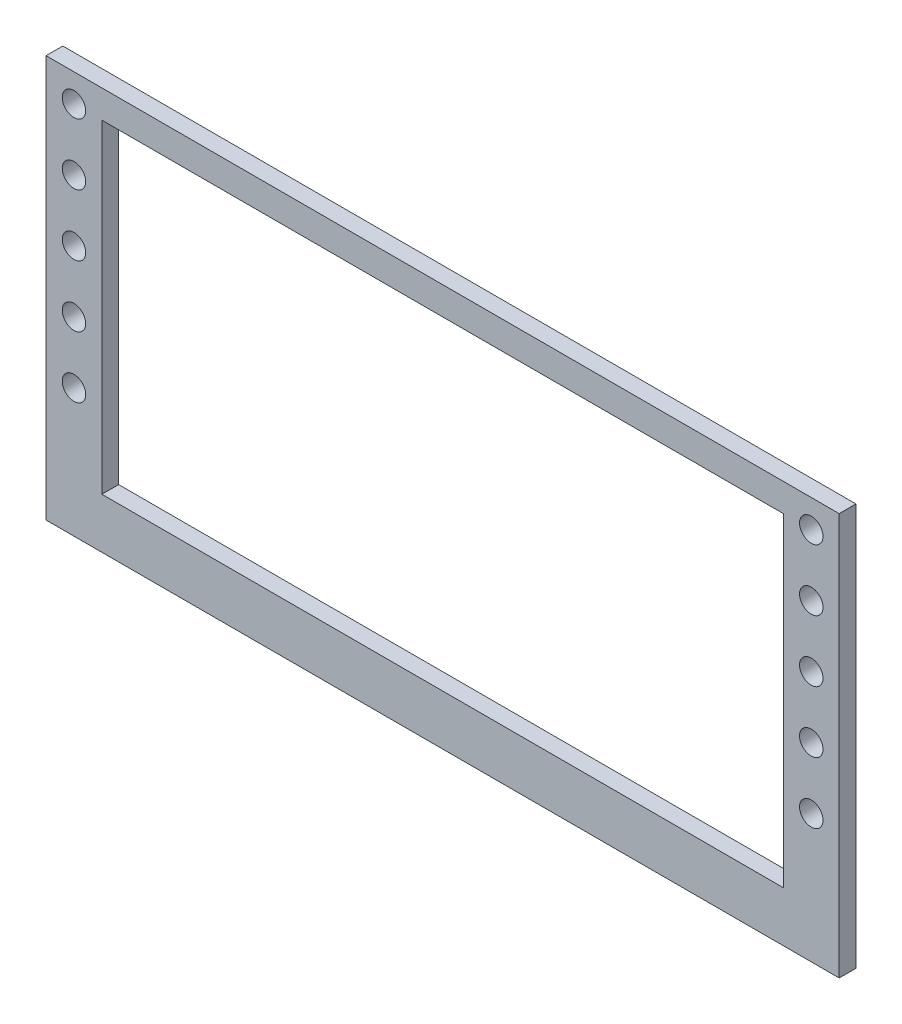
ISO-10303-21;
HEADER;
FILE_DESCRIPTION(('STEP AP214'),'2;1');
FILE_NAME('part.step','',(''),(''),'','','');
FILE_SCHEMA(('AUTOMOTIVE_DESIGN { 1 0 10303 214 1 1 1 1 }'));
ENDSEC;
DATA;
#1=APPLICATION_CONTEXT('core data for automotive mechanical design processes');
#2=APPLICATION_PROTOCOL_DEFINITION('international standard','automotive_design',2000,#1);
#3=PRODUCT_CONTEXT('',#1,'mechanical');
#4=PRODUCT('Part','Part','',(#3));
#5=PRODUCT_RELATED_PRODUCT_CATEGORY('part','',(#4));
#6=PRODUCT_DEFINITION_FORMATION('','',#4);
#7=PRODUCT_DEFINITION_CONTEXT('part definition',#1,'design');
#8=PRODUCT_DEFINITION('design','',#6,#7);
#9=PRODUCT_DEFINITION_SHAPE('','',#8);
#10=(LENGTH_UNIT() NAMED_UNIT(*) SI_UNIT(.MILLI.,.METRE.));
#11=(NAMED_UNIT(*) PLANE_ANGLE_UNIT() SI_UNIT($,.RADIAN.));
#12=(NAMED_UNIT(*) SI_UNIT($,.STERADIAN.) SOLID_ANGLE_UNIT());
#13=UNCERTAINTY_MEASURE_WITH_UNIT(LENGTH_MEASURE(1.E-05),#10,'distance_accuracy_value','');
#14=(GEOMETRIC_REPRESENTATION_CONTEXT(3) GLOBAL_UNCERTAINTY_ASSIGNED_CONTEXT((#13)) GLOBAL_UNIT_ASSIGNED_CONTEXT((#10,
#11,#12)) REPRESENTATION_CONTEXT('',''));
#15=CARTESIAN_POINT('',(0.,0.,0.));
#16=DIRECTION('',(0.,0.,1.));
#17=DIRECTION('',(1.,0.,0.));
#18=AXIS2_PLACEMENT_3D('',#15,#16,#17);
#19=CARTESIAN_POINT('',(0.,0.,3.));
#20=DIRECTION('',(0.,0.,1.));
#21=DIRECTION('',(1.,0.,0.));
#22=AXIS2_PLACEMENT_3D('',#19,#20,#21);
#23=PLANE('',#22);
#24=CARTESIAN_POINT('',(137.,34.,3.));
#25=DIRECTION('',(0.,0.,1.));
#26=DIRECTION('',(1.,0.,0.));
#27=AXIS2_PLACEMENT_3D('',#24,#25,#26);
#28=CIRCLE('',#27,2.10000000000008);
#29=CARTESIAN_POINT('',(139.1,34.,3.));
#30=VERTEX_POINT('',#29);
#31=EDGE_CURVE('E275',#30,#30,#28,.T.);
#32=ORIENTED_EDGE('',*,*,#31,.F.);
#33=EDGE_LOOP('',(#32));
#34=FACE_BOUND('',#33,.T.);
#35=CARTESIAN_POINT('',(137.,56.,3.));
#36=DIRECTION('',(0.,0.,1.));
#37=DIRECTION('',(1.,0.,0.));
#38=AXIS2_PLACEMENT_3D('',#35,#36,#37);
#39=CIRCLE('',#38,2.10000000000008);
#40=CARTESIAN_POINT('',(139.1,56.,3.));
#41=VERTEX_POINT('',#40);
#42=EDGE_CURVE('E287',#41,#41,#39,.T.);
#43=ORIENTED_EDGE('',*,*,#42,.F.);
#44=EDGE_LOOP('',(#43));
#45=FACE_BOUND('',#44,.T.);
#46=CARTESIAN_POINT('',(5.,23.,3.));
#47=DIRECTION('',(0.,0.,1.));
#48=DIRECTION('',(1.,0.,0.));
#49=AXIS2_PLACEMENT_3D('',#46,#47,#48);
#50=CIRCLE('',#49,2.10000000000007);
#51=CARTESIAN_POINT('',(7.10000000000007,23.,3.));
#52=VERTEX_POINT('',#51);
#53=EDGE_CURVE('E299',#52,#52,#50,.T.);
#54=ORIENTED_EDGE('',*,*,#53,.F.);
#55=EDGE_LOOP('',(#54));
#56=FACE_BOUND('',#55,.T.);
#57=CARTESIAN_POINT('',(5.,45.,3.));
#58=DIRECTION('',(0.,0.,1.));
#59=DIRECTION('',(1.,0.,0.));
#60=AXIS2_PLACEMENT_3D('',#57,#58,#59);
#61=CIRCLE('',#60,2.10000000000007);
#62=CARTESIAN_POINT('',(7.10000000000007,45.,3.));
#63=VERTEX_POINT('',#62);
#64=EDGE_CURVE('E311',#63,#63,#61,.T.);
#65=ORIENTED_EDGE('',*,*,#64,.F.);
#66=EDGE_LOOP('',(#65));
#67=FACE_BOUND('',#66,.T.);
#68=CARTESIAN_POINT('',(5.,67.,3.));
#69=DIRECTION('',(0.,0.,1.));
#70=DIRECTION('',(1.,0.,0.));
#71=AXIS2_PLACEMENT_3D('',#68,#69,#70);
#72=CIRCLE('',#71,2.10000000000007);
#73=CARTESIAN_POINT('',(7.10000000000007,67.,3.));
#74=VERTEX_POINT('',#73);
#75=EDGE_CURVE('E133',#74,#74,#72,.T.);
#76=ORIENTED_EDGE('',*,*,#75,.F.);
#77=EDGE_LOOP('',(#76));
#78=FACE_BOUND('',#77,.T.);
#79=DIRECTION('',(0.,-1.,0.));
#80=VECTOR('',#79,1.);
#81=CARTESIAN_POINT('',(0.,72.,3.));
#82=LINE('',#81,#80);
#83=CARTESIAN_POINT('',(0.,72.,3.));
#84=VERTEX_POINT('',#83);
#85=CARTESIAN_POINT('',(0.,0.,3.));
#86=VERTEX_POINT('',#85);
#87=EDGE_CURVE('E143',#84,#86,#82,.T.);
#88=ORIENTED_EDGE('',*,*,#87,.T.);
#89=DIRECTION('',(1.,0.,0.));
#90=VECTOR('',#89,1.);
#91=CARTESIAN_POINT('',(0.,0.,3.));
#92=LINE('',#91,#90);
#93=CARTESIAN_POINT('',(142.,0.,3.));
#94=VERTEX_POINT('',#93);
#95=EDGE_CURVE('E146',#86,#94,#92,.T.);
#96=ORIENTED_EDGE('',*,*,#95,.T.);
#97=DIRECTION('',(0.,1.,0.));
#98=VECTOR('',#97,1.);
#99=CARTESIAN_POINT('',(142.,72.,3.));
#100=LINE('',#99,#98);
#101=CARTESIAN_POINT('',(142.,72.,3.));
#102=VERTEX_POINT('',#101);
#103=EDGE_CURVE('E149',#94,#102,#100,.T.);
#104=ORIENTED_EDGE('',*,*,#103,.T.);
#105=DIRECTION('',(-1.,0.,0.));
#106=VECTOR('',#105,1.);
#107=CARTESIAN_POINT('',(0.,72.,3.));
#108=LINE('',#107,#106);
#109=EDGE_CURVE('E151',#102,#84,#108,.T.);
#110=ORIENTED_EDGE('',*,*,#109,.T.);
#111=EDGE_LOOP('',(#88,#96,#104,#110));
#112=FACE_BOUND('',#111,.T.);
#113=DIRECTION('',(1.,0.,0.));
#114=VECTOR('',#113,1.);
#115=CARTESIAN_POINT('',(10.,8.99999999999999,3.));
#116=LINE('',#115,#114);
#117=CARTESIAN_POINT('',(10.,8.99999999999999,3.));
#118=VERTEX_POINT('',#117);
#119=CARTESIAN_POINT('',(132.,8.99999999999999,3.));
#120=VERTEX_POINT('',#119);
#121=EDGE_CURVE('E112',#118,#120,#116,.T.);
#122=ORIENTED_EDGE('',*,*,#121,.F.);
#123=DIRECTION('',(0.,-1.,0.));
#124=VECTOR('',#123,1.);
#125=CARTESIAN_POINT('',(9.99999999999999,67.,3.));
#126=LINE('',#125,#124);
#127=CARTESIAN_POINT('',(9.99999999999999,67.,3.));
#128=VERTEX_POINT('',#127);
#129=EDGE_CURVE('E104',#128,#118,#126,.T.);
#130=ORIENTED_EDGE('',*,*,#129,.F.);
#131=DIRECTION('',(-1.,0.,0.));
#132=VECTOR('',#131,1.);
#133=CARTESIAN_POINT('',(9.99999999999999,67.,3.));
#134=LINE('',#133,#132);
#135=CARTESIAN_POINT('',(132.,67.,3.));
#136=VERTEX_POINT('',#135);
#137=EDGE_CURVE('E127',#136,#128,#134,.T.);
#138=ORIENTED_EDGE('',*,*,#137,.F.);
#139=DIRECTION('',(0.,1.,0.));
#140=VECTOR('',#139,1.);
#141=CARTESIAN_POINT('',(132.,67.,3.));
#142=LINE('',#141,#140);
#143=EDGE_CURVE('E125',#120,#136,#142,.T.);
#144=ORIENTED_EDGE('',*,*,#143,.F.);
#145=EDGE_LOOP('',(#122,#130,#138,#144));
#146=FACE_BOUND('',#145,.T.);
#147=CARTESIAN_POINT('',(5.,56.,3.));
#148=DIRECTION('',(0.,0.,1.));
#149=DIRECTION('',(1.,0.,0.));
#150=AXIS2_PLACEMENT_3D('',#147,#148,#149);
#151=CIRCLE('',#150,2.10000000000007);
#152=CARTESIAN_POINT('',(7.10000000000007,56.,3.));
#153=VERTEX_POINT('',#152);
#154=EDGE_CURVE('E317',#153,#153,#151,.T.);
#155=ORIENTED_EDGE('',*,*,#154,.F.);
#156=EDGE_LOOP('',(#155));
#157=FACE_BOUND('',#156,.T.);
#158=CARTESIAN_POINT('',(5.,34.,3.));
#159=DIRECTION('',(0.,0.,1.));
#160=DIRECTION('',(1.,0.,0.));
#161=AXIS2_PLACEMENT_3D('',#158,#159,#160);
#162=CIRCLE('',#161,2.10000000000007);
#163=CARTESIAN_POINT('',(7.10000000000007,34.,3.));
#164=VERTEX_POINT('',#163);
#165=EDGE_CURVE('E305',#164,#164,#162,.T.);
#166=ORIENTED_EDGE('',*,*,#165,.F.);
#167=EDGE_LOOP('',(#166));
#168=FACE_BOUND('',#167,.T.);
#169=CARTESIAN_POINT('',(137.,67.,3.));
#170=DIRECTION('',(0.,0.,1.));
#171=DIRECTION('',(1.,0.,0.));
#172=AXIS2_PLACEMENT_3D('',#169,#170,#171);
#173=CIRCLE('',#172,2.10000000000008);
#174=CARTESIAN_POINT('',(139.1,67.,3.));
#175=VERTEX_POINT('',#174);
#176=EDGE_CURVE('E293',#175,#175,#173,.T.);
#177=ORIENTED_EDGE('',*,*,#176,.F.);
#178=EDGE_LOOP('',(#177));
#179=FACE_BOUND('',#178,.T.);
#180=CARTESIAN_POINT('',(137.,45.,3.));
#181=DIRECTION('',(0.,0.,1.));
#182=DIRECTION('',(1.,0.,0.));
#183=AXIS2_PLACEMENT_3D('',#180,#181,#182);
#184=CIRCLE('',#183,2.10000000000008);
#185=CARTESIAN_POINT('',(139.1,45.,3.));
#186=VERTEX_POINT('',#185);
#187=EDGE_CURVE('E281',#186,#186,#184,.T.);
#188=ORIENTED_EDGE('',*,*,#187,.F.);
#189=EDGE_LOOP('',(#188));
#190=FACE_BOUND('',#189,.T.);
#191=CARTESIAN_POINT('',(137.,23.,3.));
#192=DIRECTION('',(0.,0.,1.));
#193=DIRECTION('',(1.,0.,0.));
#194=AXIS2_PLACEMENT_3D('',#191,#192,#193);
#195=CIRCLE('',#194,2.10000000000008);
#196=CARTESIAN_POINT('',(139.1,23.,3.));
#197=VERTEX_POINT('',#196);
#198=EDGE_CURVE('E266',#197,#197,#195,.T.);
#199=ORIENTED_EDGE('',*,*,#198,.F.);
#200=EDGE_LOOP('',(#199));
#201=FACE_BOUND('',#200,.T.);
#202=ADVANCED_FACE('F39',(#34,#45,#56,#67,#78,#112,#146,#157,#168,#179,#190,#201),#23,.T.);
#203=CARTESIAN_POINT('',(0.,0.,0.));
#204=DIRECTION('',(0.,0.,1.));
#205=DIRECTION('',(1.,0.,0.));
#206=AXIS2_PLACEMENT_3D('',#203,#204,#205);
#207=PLANE('',#206);
#208=DIRECTION('',(0.,-1.,0.));
#209=VECTOR('',#208,1.);
#210=CARTESIAN_POINT('',(0.,72.,0.));
#211=LINE('',#210,#209);
#212=CARTESIAN_POINT('',(0.,72.,0.));
#213=VERTEX_POINT('',#212);
#214=CARTESIAN_POINT('',(0.,0.,0.));
#215=VERTEX_POINT('',#214);
#216=EDGE_CURVE('E120',#213,#215,#211,.T.);
#217=ORIENTED_EDGE('',*,*,#216,.F.);
#218=DIRECTION('',(-1.,0.,0.));
#219=VECTOR('',#218,1.);
#220=CARTESIAN_POINT('',(0.,72.,0.));
#221=LINE('',#220,#219);
#222=CARTESIAN_POINT('',(142.,72.,0.));
#223=VERTEX_POINT('',#222);
#224=EDGE_CURVE('E147',#223,#213,#221,.T.);
#225=ORIENTED_EDGE('',*,*,#224,.F.);
#226=DIRECTION('',(0.,1.,0.));
#227=VECTOR('',#226,1.);
#228=CARTESIAN_POINT('',(142.,72.,0.));
#229=LINE('',#228,#227);
#230=CARTESIAN_POINT('',(142.,0.,0.));
#231=VERTEX_POINT('',#230);
#232=EDGE_CURVE('E158',#231,#223,#229,.T.);
#233=ORIENTED_EDGE('',*,*,#232,.F.);
#234=DIRECTION('',(1.,0.,0.));
#235=VECTOR('',#234,1.);
#236=CARTESIAN_POINT('',(0.,0.,0.));
#237=LINE('',#236,#235);
#238=EDGE_CURVE('E156',#215,#231,#237,.T.);
#239=ORIENTED_EDGE('',*,*,#238,.F.);
#240=EDGE_LOOP('',(#217,#225,#233,#239));
#241=FACE_BOUND('',#240,.T.);
#242=DIRECTION('',(0.,-1.,0.));
#243=VECTOR('',#242,1.);
#244=CARTESIAN_POINT('',(9.99999999999999,67.,0.));
#245=LINE('',#244,#243);
#246=CARTESIAN_POINT('',(9.99999999999999,67.,0.));
#247=VERTEX_POINT('',#246);
#248=CARTESIAN_POINT('',(10.,8.99999999999999,0.));
#249=VERTEX_POINT('',#248);
#250=EDGE_CURVE('E62',#247,#249,#245,.T.);
#251=ORIENTED_EDGE('',*,*,#250,.T.);
#252=DIRECTION('',(1.,0.,0.));
#253=VECTOR('',#252,1.);
#254=CARTESIAN_POINT('',(10.,8.99999999999999,0.));
#255=LINE('',#254,#253);
#256=CARTESIAN_POINT('',(132.,8.99999999999999,0.));
#257=VERTEX_POINT('',#256);
#258=EDGE_CURVE('E119',#249,#257,#255,.T.);
#259=ORIENTED_EDGE('',*,*,#258,.T.);
#260=DIRECTION('',(0.,1.,0.));
#261=VECTOR('',#260,1.);
#262=CARTESIAN_POINT('',(132.,67.,0.));
#263=LINE('',#262,#261);
#264=CARTESIAN_POINT('',(132.,67.,0.));
#265=VERTEX_POINT('',#264);
#266=EDGE_CURVE('E135',#257,#265,#263,.T.);
#267=ORIENTED_EDGE('',*,*,#266,.T.);
#268=DIRECTION('',(-1.,0.,0.));
#269=VECTOR('',#268,1.);
#270=CARTESIAN_POINT('',(9.99999999999999,67.,0.));
#271=LINE('',#270,#269);
#272=EDGE_CURVE('E113',#265,#247,#271,.T.);
#273=ORIENTED_EDGE('',*,*,#272,.T.);
#274=EDGE_LOOP('',(#251,#259,#267,#273));
#275=FACE_BOUND('',#274,.T.);
#276=CARTESIAN_POINT('',(5.,67.,0.));
#277=DIRECTION('',(0.,0.,1.));
#278=DIRECTION('',(1.,0.,0.));
#279=AXIS2_PLACEMENT_3D('',#276,#277,#278);
#280=CIRCLE('',#279,2.10000000000007);
#281=CARTESIAN_POINT('',(7.10000000000007,67.,0.));
#282=VERTEX_POINT('',#281);
#283=EDGE_CURVE('E320',#282,#282,#280,.T.);
#284=ORIENTED_EDGE('',*,*,#283,.T.);
#285=EDGE_LOOP('',(#284));
#286=FACE_BOUND('',#285,.T.);
#287=CARTESIAN_POINT('',(5.,56.,0.));
#288=DIRECTION('',(0.,0.,1.));
#289=DIRECTION('',(1.,0.,0.));
#290=AXIS2_PLACEMENT_3D('',#287,#288,#289);
#291=CIRCLE('',#290,2.10000000000007);
#292=CARTESIAN_POINT('',(7.10000000000007,56.,0.));
#293=VERTEX_POINT('',#292);
#294=EDGE_CURVE('E314',#293,#293,#291,.T.);
#295=ORIENTED_EDGE('',*,*,#294,.T.);
#296=EDGE_LOOP('',(#295));
#297=FACE_BOUND('',#296,.T.);
#298=CARTESIAN_POINT('',(5.,45.,0.));
#299=DIRECTION('',(0.,0.,1.));
#300=DIRECTION('',(1.,0.,0.));
#301=AXIS2_PLACEMENT_3D('',#298,#299,#300);
#302=CIRCLE('',#301,2.10000000000007);
#303=CARTESIAN_POINT('',(7.10000000000007,45.,0.));
#304=VERTEX_POINT('',#303);
#305=EDGE_CURVE('E308',#304,#304,#302,.T.);
#306=ORIENTED_EDGE('',*,*,#305,.T.);
#307=EDGE_LOOP('',(#306));
#308=FACE_BOUND('',#307,.T.);
#309=CARTESIAN_POINT('',(5.,34.,0.));
#310=DIRECTION('',(0.,0.,1.));
#311=DIRECTION('',(1.,0.,0.));
#312=AXIS2_PLACEMENT_3D('',#309,#310,#311);
#313=CIRCLE('',#312,2.10000000000007);
#314=CARTESIAN_POINT('',(7.10000000000007,34.,0.));
#315=VERTEX_POINT('',#314);
#316=EDGE_CURVE('E302',#315,#315,#313,.T.);
#317=ORIENTED_EDGE('',*,*,#316,.T.);
#318=EDGE_LOOP('',(#317));
#319=FACE_BOUND('',#318,.T.);
#320=CARTESIAN_POINT('',(5.,23.,0.));
#321=DIRECTION('',(0.,0.,1.));
#322=DIRECTION('',(1.,0.,0.));
#323=AXIS2_PLACEMENT_3D('',#320,#321,#322);
#324=CIRCLE('',#323,2.10000000000007);
#325=CARTESIAN_POINT('',(7.10000000000007,23.,0.));
#326=VERTEX_POINT('',#325);
#327=EDGE_CURVE('E296',#326,#326,#324,.T.);
#328=ORIENTED_EDGE('',*,*,#327,.T.);
#329=EDGE_LOOP('',(#328));
#330=FACE_BOUND('',#329,.T.);
#331=CARTESIAN_POINT('',(137.,67.,0.));
#332=DIRECTION('',(0.,0.,1.));
#333=DIRECTION('',(1.,0.,0.));
#334=AXIS2_PLACEMENT_3D('',#331,#332,#333);
#335=CIRCLE('',#334,2.10000000000008);
#336=CARTESIAN_POINT('',(139.1,67.,0.));
#337=VERTEX_POINT('',#336);
#338=EDGE_CURVE('E290',#337,#337,#335,.T.);
#339=ORIENTED_EDGE('',*,*,#338,.T.);
#340=EDGE_LOOP('',(#339));
#341=FACE_BOUND('',#340,.T.);
#342=CARTESIAN_POINT('',(137.,56.,0.));
#343=DIRECTION('',(0.,0.,1.));
#344=DIRECTION('',(1.,0.,0.));
#345=AXIS2_PLACEMENT_3D('',#342,#343,#344);
#346=CIRCLE('',#345,2.10000000000008);
#347=CARTESIAN_POINT('',(139.1,56.,0.));
#348=VERTEX_POINT('',#347);
#349=EDGE_CURVE('E284',#348,#348,#346,.T.);
#350=ORIENTED_EDGE('',*,*,#349,.T.);
#351=EDGE_LOOP('',(#350));
#352=FACE_BOUND('',#351,.T.);
#353=CARTESIAN_POINT('',(137.,45.,0.));
#354=DIRECTION('',(0.,0.,1.));
#355=DIRECTION('',(1.,0.,0.));
#356=AXIS2_PLACEMENT_3D('',#353,#354,#355);
#357=CIRCLE('',#356,2.10000000000008);
#358=CARTESIAN_POINT('',(139.1,45.,0.));
#359=VERTEX_POINT('',#358);
#360=EDGE_CURVE('E278',#359,#359,#357,.T.);
#361=ORIENTED_EDGE('',*,*,#360,.T.);
#362=EDGE_LOOP('',(#361));
#363=FACE_BOUND('',#362,.T.);
#364=CARTESIAN_POINT('',(137.,34.,0.));
#365=DIRECTION('',(0.,0.,1.));
#366=DIRECTION('',(1.,0.,0.));
#367=AXIS2_PLACEMENT_3D('',#364,#365,#366);
#368=CIRCLE('',#367,2.10000000000008);
#369=CARTESIAN_POINT('',(139.1,34.,0.));
#370=VERTEX_POINT('',#369);
#371=EDGE_CURVE('E272',#370,#370,#368,.T.);
#372=ORIENTED_EDGE('',*,*,#371,.T.);
#373=EDGE_LOOP('',(#372));
#374=FACE_BOUND('',#373,.T.);
#375=CARTESIAN_POINT('',(137.,23.,0.));
#376=DIRECTION('',(0.,0.,1.));
#377=DIRECTION('',(1.,0.,0.));
#378=AXIS2_PLACEMENT_3D('',#375,#376,#377);
#379=CIRCLE('',#378,2.10000000000008);
#380=CARTESIAN_POINT('',(139.1,23.,0.));
#381=VERTEX_POINT('',#380);
#382=EDGE_CURVE('E269',#381,#381,#379,.T.);
#383=ORIENTED_EDGE('',*,*,#382,.T.);
#384=EDGE_LOOP('',(#383));
#385=FACE_BOUND('',#384,.T.);
#386=ADVANCED_FACE('F176',(#241,#275,#286,#297,#308,#319,#330,#341,#352,#363,#374,#385),#207,.F.);
#387=CARTESIAN_POINT('',(0.,72.,3.));
#388=DIRECTION('',(1.,0.,0.));
#389=DIRECTION('',(0.,1.,0.));
#390=AXIS2_PLACEMENT_3D('',#387,#388,#389);
#391=PLANE('',#390);
#392=ORIENTED_EDGE('',*,*,#216,.T.);
#393=DIRECTION('',(0.,0.,-1.));
#394=VECTOR('',#393,1.);
#395=CARTESIAN_POINT('',(0.,0.,3.));
#396=LINE('',#395,#394);
#397=EDGE_CURVE('E11',#86,#215,#396,.T.);
#398=ORIENTED_EDGE('',*,*,#397,.F.);
#399=ORIENTED_EDGE('',*,*,#87,.F.);
#400=DIRECTION('',(0.,0.,-1.));
#401=VECTOR('',#400,1.);
#402=CARTESIAN_POINT('',(0.,72.,3.));
#403=LINE('',#402,#401);
#404=EDGE_CURVE('E153',#84,#213,#403,.T.);
#405=ORIENTED_EDGE('',*,*,#404,.T.);
#406=EDGE_LOOP('',(#392,#398,#399,#405));
#407=FACE_BOUND('',#406,.T.);
#408=ADVANCED_FACE('F41',(#407),#391,.F.);
#409=CARTESIAN_POINT('',(0.,0.,3.));
#410=DIRECTION('',(0.,1.,0.));
#411=DIRECTION('',(0.,0.,1.));
#412=AXIS2_PLACEMENT_3D('',#409,#410,#411);
#413=PLANE('',#412);
#414=ORIENTED_EDGE('',*,*,#238,.T.);
#415=DIRECTION('',(0.,0.,-1.));
#416=VECTOR('',#415,1.);
#417=CARTESIAN_POINT('',(142.,0.,3.));
#418=LINE('',#417,#416);
#419=EDGE_CURVE('E47',#94,#231,#418,.T.);
#420=ORIENTED_EDGE('',*,*,#419,.F.);
#421=ORIENTED_EDGE('',*,*,#95,.F.);
#422=ORIENTED_EDGE('',*,*,#397,.T.);
#423=EDGE_LOOP('',(#414,#420,#421,#422));
#424=FACE_BOUND('',#423,.T.);
#425=ADVANCED_FACE('F186',(#424),#413,.F.);
#426=CARTESIAN_POINT('',(142.,72.,3.));
#427=DIRECTION('',(-1.,0.,0.));
#428=DIRECTION('',(0.,-1.,0.));
#429=AXIS2_PLACEMENT_3D('',#426,#427,#428);
#430=PLANE('',#429);
#431=ORIENTED_EDGE('',*,*,#232,.T.);
#432=DIRECTION('',(0.,0.,-1.));
#433=VECTOR('',#432,1.);
#434=CARTESIAN_POINT('',(142.,72.,3.));
#435=LINE('',#434,#433);
#436=EDGE_CURVE('E163',#102,#223,#435,.T.);
#437=ORIENTED_EDGE('',*,*,#436,.F.);
#438=ORIENTED_EDGE('',*,*,#103,.F.);
#439=ORIENTED_EDGE('',*,*,#419,.T.);
#440=EDGE_LOOP('',(#431,#437,#438,#439));
#441=FACE_BOUND('',#440,.T.);
#442=ADVANCED_FACE('F170',(#441),#430,.F.);
#443=CARTESIAN_POINT('',(0.,72.,3.));
#444=DIRECTION('',(0.,-1.,0.));
#445=DIRECTION('',(0.,0.,-1.));
#446=AXIS2_PLACEMENT_3D('',#443,#444,#445);
#447=PLANE('',#446);
#448=ORIENTED_EDGE('',*,*,#224,.T.);
#449=ORIENTED_EDGE('',*,*,#404,.F.);
#450=ORIENTED_EDGE('',*,*,#109,.F.);
#451=ORIENTED_EDGE('',*,*,#436,.T.);
#452=EDGE_LOOP('',(#448,#449,#450,#451));
#453=FACE_BOUND('',#452,.T.);
#454=ADVANCED_FACE('F180',(#453),#447,.F.);
#455=CARTESIAN_POINT('',(9.99999999999999,67.,3.));
#456=DIRECTION('',(1.,0.,0.));
#457=DIRECTION('',(0.,1.,0.));
#458=AXIS2_PLACEMENT_3D('',#455,#456,#457);
#459=PLANE('',#458);
#460=ORIENTED_EDGE('',*,*,#250,.F.);
#461=DIRECTION('',(0.,0.,-1.));
#462=VECTOR('',#461,1.);
#463=CARTESIAN_POINT('',(9.99999999999999,67.,3.));
#464=LINE('',#463,#462);
#465=EDGE_CURVE('E108',#128,#247,#464,.T.);
#466=ORIENTED_EDGE('',*,*,#465,.F.);
#467=ORIENTED_EDGE('',*,*,#129,.T.);
#468=DIRECTION('',(0.,0.,-1.));
#469=VECTOR('',#468,1.);
#470=CARTESIAN_POINT('',(10.,8.99999999999999,3.));
#471=LINE('',#470,#469);
#472=EDGE_CURVE('E107',#118,#249,#471,.T.);
#473=ORIENTED_EDGE('',*,*,#472,.T.);
#474=EDGE_LOOP('',(#460,#466,#467,#473));
#475=FACE_BOUND('',#474,.T.);
#476=ADVANCED_FACE('F106',(#475),#459,.T.);
#477=CARTESIAN_POINT('',(10.,8.99999999999999,3.));
#478=DIRECTION('',(0.,1.,0.));
#479=DIRECTION('',(0.,0.,1.));
#480=AXIS2_PLACEMENT_3D('',#477,#478,#479);
#481=PLANE('',#480);
#482=ORIENTED_EDGE('',*,*,#258,.F.);
#483=ORIENTED_EDGE('',*,*,#472,.F.);
#484=ORIENTED_EDGE('',*,*,#121,.T.);
#485=DIRECTION('',(0.,0.,-1.));
#486=VECTOR('',#485,1.);
#487=CARTESIAN_POINT('',(132.,8.99999999999999,3.));
#488=LINE('',#487,#486);
#489=EDGE_CURVE('E121',#120,#257,#488,.T.);
#490=ORIENTED_EDGE('',*,*,#489,.T.);
#491=EDGE_LOOP('',(#482,#483,#484,#490));
#492=FACE_BOUND('',#491,.T.);
#493=ADVANCED_FACE('F116',(#492),#481,.T.);
#494=CARTESIAN_POINT('',(132.,67.,3.));
#495=DIRECTION('',(-1.,0.,0.));
#496=DIRECTION('',(0.,-1.,0.));
#497=AXIS2_PLACEMENT_3D('',#494,#495,#496);
#498=PLANE('',#497);
#499=ORIENTED_EDGE('',*,*,#266,.F.);
#500=ORIENTED_EDGE('',*,*,#489,.F.);
#501=ORIENTED_EDGE('',*,*,#143,.T.);
#502=DIRECTION('',(0.,0.,-1.));
#503=VECTOR('',#502,1.);
#504=CARTESIAN_POINT('',(132.,67.,3.));
#505=LINE('',#504,#503);
#506=EDGE_CURVE('E54',#136,#265,#505,.T.);
#507=ORIENTED_EDGE('',*,*,#506,.T.);
#508=EDGE_LOOP('',(#499,#500,#501,#507));
#509=FACE_BOUND('',#508,.T.);
#510=ADVANCED_FACE('F212',(#509),#498,.T.);
#511=CARTESIAN_POINT('',(9.99999999999999,67.,3.));
#512=DIRECTION('',(0.,-1.,0.));
#513=DIRECTION('',(0.,0.,-1.));
#514=AXIS2_PLACEMENT_3D('',#511,#512,#513);
#515=PLANE('',#514);
#516=ORIENTED_EDGE('',*,*,#272,.F.);
#517=ORIENTED_EDGE('',*,*,#506,.F.);
#518=ORIENTED_EDGE('',*,*,#137,.T.);
#519=ORIENTED_EDGE('',*,*,#465,.T.);
#520=EDGE_LOOP('',(#516,#517,#518,#519));
#521=FACE_BOUND('',#520,.T.);
#522=ADVANCED_FACE('F216',(#521),#515,.T.);
#523=CARTESIAN_POINT('',(5.,67.,3.));
#524=DIRECTION('',(0.,0.,-1.));
#525=DIRECTION('',(-1.,0.,0.));
#526=AXIS2_PLACEMENT_3D('',#523,#524,#525);
#527=CYLINDRICAL_SURFACE('',#526,2.10000000000007);
#528=ORIENTED_EDGE('',*,*,#75,.T.);
#529=EDGE_LOOP('',(#528));
#530=FACE_BOUND('',#529,.T.);
#531=ORIENTED_EDGE('',*,*,#283,.F.);
#532=EDGE_LOOP('',(#531));
#533=FACE_BOUND('',#532,.T.);
#534=ADVANCED_FACE('F222',(#530,#533),#527,.F.);
#535=CARTESIAN_POINT('',(5.,56.,3.));
#536=DIRECTION('',(0.,0.,-1.));
#537=DIRECTION('',(-1.,0.,0.));
#538=AXIS2_PLACEMENT_3D('',#535,#536,#537);
#539=CYLINDRICAL_SURFACE('',#538,2.10000000000007);
#540=ORIENTED_EDGE('',*,*,#154,.T.);
#541=EDGE_LOOP('',(#540));
#542=FACE_BOUND('',#541,.T.);
#543=ORIENTED_EDGE('',*,*,#294,.F.);
#544=EDGE_LOOP('',(#543));
#545=FACE_BOUND('',#544,.T.);
#546=ADVANCED_FACE('F225',(#542,#545),#539,.F.);
#547=CARTESIAN_POINT('',(5.,45.,3.));
#548=DIRECTION('',(0.,0.,-1.));
#549=DIRECTION('',(-1.,0.,0.));
#550=AXIS2_PLACEMENT_3D('',#547,#548,#549);
#551=CYLINDRICAL_SURFACE('',#550,2.10000000000007);
#552=ORIENTED_EDGE('',*,*,#64,.T.);
#553=EDGE_LOOP('',(#552));
#554=FACE_BOUND('',#553,.T.);
#555=ORIENTED_EDGE('',*,*,#305,.F.);
#556=EDGE_LOOP('',(#555));
#557=FACE_BOUND('',#556,.T.);
#558=ADVANCED_FACE('F229',(#554,#557),#551,.F.);
#559=CARTESIAN_POINT('',(5.,34.,3.));
#560=DIRECTION('',(0.,0.,-1.));
#561=DIRECTION('',(-1.,0.,0.));
#562=AXIS2_PLACEMENT_3D('',#559,#560,#561);
#563=CYLINDRICAL_SURFACE('',#562,2.10000000000007);
#564=ORIENTED_EDGE('',*,*,#165,.T.);
#565=EDGE_LOOP('',(#564));
#566=FACE_BOUND('',#565,.T.);
#567=ORIENTED_EDGE('',*,*,#316,.F.);
#568=EDGE_LOOP('',(#567));
#569=FACE_BOUND('',#568,.T.);
#570=ADVANCED_FACE('F233',(#566,#569),#563,.F.);
#571=CARTESIAN_POINT('',(5.,23.,3.));
#572=DIRECTION('',(0.,0.,-1.));
#573=DIRECTION('',(-1.,0.,0.));
#574=AXIS2_PLACEMENT_3D('',#571,#572,#573);
#575=CYLINDRICAL_SURFACE('',#574,2.10000000000007);
#576=ORIENTED_EDGE('',*,*,#53,.T.);
#577=EDGE_LOOP('',(#576));
#578=FACE_BOUND('',#577,.T.);
#579=ORIENTED_EDGE('',*,*,#327,.F.);
#580=EDGE_LOOP('',(#579));
#581=FACE_BOUND('',#580,.T.);
#582=ADVANCED_FACE('F237',(#578,#581),#575,.F.);
#583=CARTESIAN_POINT('',(137.,67.,3.));
#584=DIRECTION('',(0.,0.,-1.));
#585=DIRECTION('',(-1.,0.,0.));
#586=AXIS2_PLACEMENT_3D('',#583,#584,#585);
#587=CYLINDRICAL_SURFACE('',#586,2.10000000000008);
#588=ORIENTED_EDGE('',*,*,#176,.T.);
#589=EDGE_LOOP('',(#588));
#590=FACE_BOUND('',#589,.T.);
#591=ORIENTED_EDGE('',*,*,#338,.F.);
#592=EDGE_LOOP('',(#591));
#593=FACE_BOUND('',#592,.T.);
#594=ADVANCED_FACE('F241',(#590,#593),#587,.F.);
#595=CARTESIAN_POINT('',(137.,56.,3.));
#596=DIRECTION('',(0.,0.,-1.));
#597=DIRECTION('',(-1.,0.,0.));
#598=AXIS2_PLACEMENT_3D('',#595,#596,#597);
#599=CYLINDRICAL_SURFACE('',#598,2.10000000000008);
#600=ORIENTED_EDGE('',*,*,#42,.T.);
#601=EDGE_LOOP('',(#600));
#602=FACE_BOUND('',#601,.T.);
#603=ORIENTED_EDGE('',*,*,#349,.F.);
#604=EDGE_LOOP('',(#603));
#605=FACE_BOUND('',#604,.T.);
#606=ADVANCED_FACE('F245',(#602,#605),#599,.F.);
#607=CARTESIAN_POINT('',(137.,45.,3.));
#608=DIRECTION('',(0.,0.,-1.));
#609=DIRECTION('',(-1.,0.,0.));
#610=AXIS2_PLACEMENT_3D('',#607,#608,#609);
#611=CYLINDRICAL_SURFACE('',#610,2.10000000000008);
#612=ORIENTED_EDGE('',*,*,#187,.T.);
#613=EDGE_LOOP('',(#612));
#614=FACE_BOUND('',#613,.T.);
#615=ORIENTED_EDGE('',*,*,#360,.F.);
#616=EDGE_LOOP('',(#615));
#617=FACE_BOUND('',#616,.T.);
#618=ADVANCED_FACE('F249',(#614,#617),#611,.F.);
#619=CARTESIAN_POINT('',(137.,34.,3.));
#620=DIRECTION('',(0.,0.,-1.));
#621=DIRECTION('',(-1.,0.,0.));
#622=AXIS2_PLACEMENT_3D('',#619,#620,#621);
#623=CYLINDRICAL_SURFACE('',#622,2.10000000000008);
#624=ORIENTED_EDGE('',*,*,#31,.T.);
#625=EDGE_LOOP('',(#624));
#626=FACE_BOUND('',#625,.T.);
#627=ORIENTED_EDGE('',*,*,#371,.F.);
#628=EDGE_LOOP('',(#627));
#629=FACE_BOUND('',#628,.T.);
#630=ADVANCED_FACE('F253',(#626,#629),#623,.F.);
#631=CARTESIAN_POINT('',(137.,23.,3.));
#632=DIRECTION('',(0.,0.,-1.));
#633=DIRECTION('',(-1.,0.,0.));
#634=AXIS2_PLACEMENT_3D('',#631,#632,#633);
#635=CYLINDRICAL_SURFACE('',#634,2.10000000000008);
#636=ORIENTED_EDGE('',*,*,#198,.T.);
#637=EDGE_LOOP('',(#636));
#638=FACE_BOUND('',#637,.T.);
#639=ORIENTED_EDGE('',*,*,#382,.F.);
#640=EDGE_LOOP('',(#639));
#641=FACE_BOUND('',#640,.T.);
#642=ADVANCED_FACE('F257',(#638,#641),#635,.F.);
#643=CLOSED_SHELL('',(#202,#386,#408,#425,#442,#454,#476,#493,#510,#522,#534,#546,#558,#570,
#582,#594,#606,#618,#630,#642));
#644=MANIFOLD_SOLID_BREP('B2',#643);
#645=ADVANCED_BREP_SHAPE_REPRESENTATION('',(#18,#644),#14);
#646=SHAPE_DEFINITION_REPRESENTATION(#9,#645);
ENDSEC;
END-ISO-10303-21;
